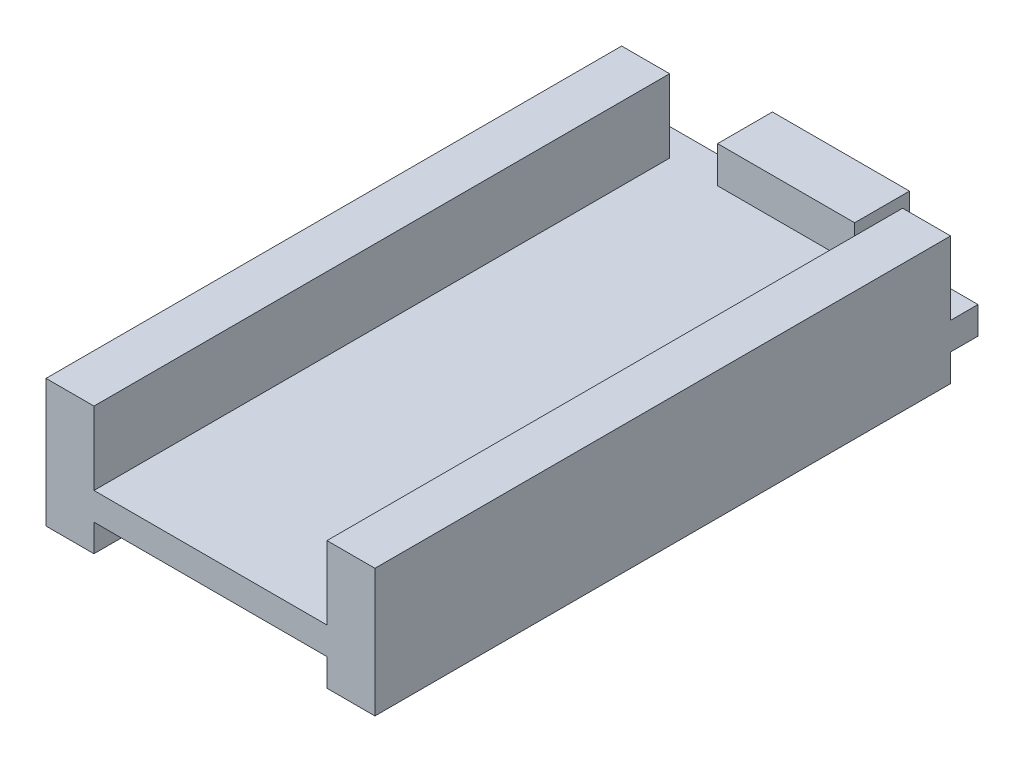
ISO-10303-21;
HEADER;
FILE_DESCRIPTION(('STEP AP214'),'2;1');
FILE_NAME('part.step','',(''),(''),'','','');
FILE_SCHEMA(('AUTOMOTIVE_DESIGN { 1 0 10303 214 1 1 1 1 }'));
ENDSEC;
DATA;
#1=APPLICATION_CONTEXT('core data for automotive mechanical design processes');
#2=APPLICATION_PROTOCOL_DEFINITION('international standard','automotive_design',2000,#1);
#3=PRODUCT_CONTEXT('',#1,'mechanical');
#4=PRODUCT('Part','Part','',(#3));
#5=PRODUCT_RELATED_PRODUCT_CATEGORY('part','',(#4));
#6=PRODUCT_DEFINITION_FORMATION('','',#4);
#7=PRODUCT_DEFINITION_CONTEXT('part definition',#1,'design');
#8=PRODUCT_DEFINITION('design','',#6,#7);
#9=PRODUCT_DEFINITION_SHAPE('','',#8);
#10=(LENGTH_UNIT() NAMED_UNIT(*) SI_UNIT(.MILLI.,.METRE.));
#11=(NAMED_UNIT(*) PLANE_ANGLE_UNIT() SI_UNIT($,.RADIAN.));
#12=(NAMED_UNIT(*) SI_UNIT($,.STERADIAN.) SOLID_ANGLE_UNIT());
#13=UNCERTAINTY_MEASURE_WITH_UNIT(LENGTH_MEASURE(1.E-05),#10,'distance_accuracy_value','');
#14=(GEOMETRIC_REPRESENTATION_CONTEXT(3) GLOBAL_UNCERTAINTY_ASSIGNED_CONTEXT((#13)) GLOBAL_UNIT_ASSIGNED_CONTEXT((#10,
#11,#12)) REPRESENTATION_CONTEXT('',''));
#15=CARTESIAN_POINT('',(0.,0.,0.));
#16=DIRECTION('',(0.,0.,1.));
#17=DIRECTION('',(1.,0.,0.));
#18=AXIS2_PLACEMENT_3D('',#15,#16,#17);
#19=CARTESIAN_POINT('',(0.,1.5,0.));
#20=DIRECTION('',(0.,1.,0.));
#21=DIRECTION('',(0.,0.,1.));
#22=AXIS2_PLACEMENT_3D('',#19,#20,#21);
#23=PLANE('',#22);
#24=DIRECTION('',(0.,0.,1.));
#25=VECTOR('',#24,1.);
#26=CARTESIAN_POINT('',(6.37499999999998,1.5,0.));
#27=LINE('',#26,#25);
#28=CARTESIAN_POINT('',(6.37500000000003,1.5,-15.));
#29=VERTEX_POINT('',#28);
#30=CARTESIAN_POINT('',(6.37499999999994,1.5,16.5));
#31=VERTEX_POINT('',#30);
#32=EDGE_CURVE('E48',#29,#31,#27,.T.);
#33=ORIENTED_EDGE('',*,*,#32,.F.);
#34=DIRECTION('',(1.,0.,0.));
#35=VECTOR('',#34,1.);
#36=CARTESIAN_POINT('',(0.,1.5,-15.));
#37=LINE('',#36,#35);
#38=CARTESIAN_POINT('',(8.99999999999996,1.5,-15.));
#39=VERTEX_POINT('',#38);
#40=EDGE_CURVE('E52',#29,#39,#37,.T.);
#41=ORIENTED_EDGE('',*,*,#40,.T.);
#42=DIRECTION('',(0.,0.,-1.));
#43=VECTOR('',#42,1.);
#44=CARTESIAN_POINT('',(8.99999999999996,1.5,0.));
#45=LINE('',#44,#43);
#46=CARTESIAN_POINT('',(8.99999999999996,1.5,-16.5));
#47=VERTEX_POINT('',#46);
#48=EDGE_CURVE('E178',#39,#47,#45,.T.);
#49=ORIENTED_EDGE('',*,*,#48,.T.);
#50=DIRECTION('',(1.,0.,0.));
#51=VECTOR('',#50,1.);
#52=CARTESIAN_POINT('',(0.,1.5,-16.5));
#53=LINE('',#52,#51);
#54=CARTESIAN_POINT('',(3.75,1.5,-16.5));
#55=VERTEX_POINT('',#54);
#56=EDGE_CURVE('E301',#55,#47,#53,.T.);
#57=ORIENTED_EDGE('',*,*,#56,.F.);
#58=DIRECTION('',(0.,0.,1.));
#59=VECTOR('',#58,1.);
#60=CARTESIAN_POINT('',(3.75,1.5,0.));
#61=LINE('',#60,#59);
#62=CARTESIAN_POINT('',(3.75,1.5,-15.));
#63=VERTEX_POINT('',#62);
#64=EDGE_CURVE('E278',#55,#63,#61,.T.);
#65=ORIENTED_EDGE('',*,*,#64,.T.);
#66=DIRECTION('',(-1.,0.,0.));
#67=VECTOR('',#66,1.);
#68=CARTESIAN_POINT('',(0.,1.5,-15.));
#69=LINE('',#68,#67);
#70=CARTESIAN_POINT('',(-3.75,1.5,-15.));
#71=VERTEX_POINT('',#70);
#72=EDGE_CURVE('E277',#63,#71,#69,.T.);
#73=ORIENTED_EDGE('',*,*,#72,.T.);
#74=DIRECTION('',(0.,0.,1.));
#75=VECTOR('',#74,1.);
#76=CARTESIAN_POINT('',(-3.75,1.5,0.));
#77=LINE('',#76,#75);
#78=CARTESIAN_POINT('',(-3.75,1.5,-16.5));
#79=VERTEX_POINT('',#78);
#80=EDGE_CURVE('E283',#79,#71,#77,.T.);
#81=ORIENTED_EDGE('',*,*,#80,.F.);
#82=CARTESIAN_POINT('',(-9.00000000000004,1.5,-16.5));
#83=VERTEX_POINT('',#82);
#84=EDGE_CURVE('E296',#83,#79,#53,.T.);
#85=ORIENTED_EDGE('',*,*,#84,.F.);
#86=DIRECTION('',(0.,0.,-1.));
#87=VECTOR('',#86,1.);
#88=CARTESIAN_POINT('',(-9.00000000000004,1.5,0.));
#89=LINE('',#88,#87);
#90=CARTESIAN_POINT('',(-9.00000000000004,1.5,-15.));
#91=VERTEX_POINT('',#90);
#92=EDGE_CURVE('E299',#91,#83,#89,.T.);
#93=ORIENTED_EDGE('',*,*,#92,.F.);
#94=DIRECTION('',(-1.,0.,0.));
#95=VECTOR('',#94,1.);
#96=CARTESIAN_POINT('',(0.,1.5,-15.));
#97=LINE('',#96,#95);
#98=CARTESIAN_POINT('',(-6.37500000000001,1.5,-15.));
#99=VERTEX_POINT('',#98);
#100=EDGE_CURVE('E259',#99,#91,#97,.T.);
#101=ORIENTED_EDGE('',*,*,#100,.F.);
#102=DIRECTION('',(0.,0.,1.));
#103=VECTOR('',#102,1.);
#104=CARTESIAN_POINT('',(-6.37500000000001,1.5,0.));
#105=LINE('',#104,#103);
#106=CARTESIAN_POINT('',(-6.37500000000001,1.5,16.5));
#107=VERTEX_POINT('',#106);
#108=EDGE_CURVE('E248',#99,#107,#105,.T.);
#109=ORIENTED_EDGE('',*,*,#108,.T.);
#110=DIRECTION('',(1.,0.,0.));
#111=VECTOR('',#110,1.);
#112=CARTESIAN_POINT('',(0.,1.5,16.5));
#113=LINE('',#112,#111);
#114=EDGE_CURVE('E303',#107,#31,#113,.T.);
#115=ORIENTED_EDGE('',*,*,#114,.T.);
#116=EDGE_LOOP('',(#33,#41,#49,#57,#65,#73,#81,#85,#93,#101,#109,#115));
#117=FACE_BOUND('',#116,.T.);
#118=ADVANCED_FACE('F33',(#117),#23,.T.);
#119=CARTESIAN_POINT('',(0.,0.,0.));
#120=DIRECTION('',(0.,1.,0.));
#121=DIRECTION('',(0.,0.,1.));
#122=AXIS2_PLACEMENT_3D('',#119,#120,#121);
#123=PLANE('',#122);
#124=DIRECTION('',(1.,0.,0.));
#125=VECTOR('',#124,1.);
#126=CARTESIAN_POINT('',(0.,0.,-15.));
#127=LINE('',#126,#125);
#128=CARTESIAN_POINT('',(6.37500000000003,0.,-15.));
#129=VERTEX_POINT('',#128);
#130=CARTESIAN_POINT('',(8.99999999999996,0.,-15.));
#131=VERTEX_POINT('',#130);
#132=EDGE_CURVE('E11',#129,#131,#127,.T.);
#133=ORIENTED_EDGE('',*,*,#132,.F.);
#134=DIRECTION('',(0.,0.,1.));
#135=VECTOR('',#134,1.);
#136=CARTESIAN_POINT('',(6.37499999999998,0.,0.));
#137=LINE('',#136,#135);
#138=CARTESIAN_POINT('',(6.37499999999998,0.,16.5));
#139=VERTEX_POINT('',#138);
#140=EDGE_CURVE('E41',#129,#139,#137,.T.);
#141=ORIENTED_EDGE('',*,*,#140,.T.);
#142=DIRECTION('',(1.,0.,0.));
#143=VECTOR('',#142,1.);
#144=CARTESIAN_POINT('',(0.,0.,16.5));
#145=LINE('',#144,#143);
#146=CARTESIAN_POINT('',(-6.37500000000001,0.,16.5));
#147=VERTEX_POINT('',#146);
#148=EDGE_CURVE('E311',#147,#139,#145,.T.);
#149=ORIENTED_EDGE('',*,*,#148,.F.);
#150=DIRECTION('',(0.,0.,1.));
#151=VECTOR('',#150,1.);
#152=CARTESIAN_POINT('',(-6.37500000000001,0.,0.));
#153=LINE('',#152,#151);
#154=CARTESIAN_POINT('',(-6.37500000000001,0.,-15.));
#155=VERTEX_POINT('',#154);
#156=EDGE_CURVE('E325',#155,#147,#153,.T.);
#157=ORIENTED_EDGE('',*,*,#156,.F.);
#158=DIRECTION('',(-1.,0.,0.));
#159=VECTOR('',#158,1.);
#160=CARTESIAN_POINT('',(0.,0.,-15.));
#161=LINE('',#160,#159);
#162=CARTESIAN_POINT('',(-9.00000000000004,0.,-15.));
#163=VERTEX_POINT('',#162);
#164=EDGE_CURVE('E328',#155,#163,#161,.T.);
#165=ORIENTED_EDGE('',*,*,#164,.T.);
#166=DIRECTION('',(0.,0.,-1.));
#167=VECTOR('',#166,1.);
#168=CARTESIAN_POINT('',(-9.00000000000004,0.,0.));
#169=LINE('',#168,#167);
#170=CARTESIAN_POINT('',(-9.00000000000004,0.,-16.5));
#171=VERTEX_POINT('',#170);
#172=EDGE_CURVE('E309',#163,#171,#169,.T.);
#173=ORIENTED_EDGE('',*,*,#172,.T.);
#174=DIRECTION('',(1.,0.,0.));
#175=VECTOR('',#174,1.);
#176=CARTESIAN_POINT('',(0.,0.,-16.5));
#177=LINE('',#176,#175);
#178=CARTESIAN_POINT('',(8.99999999999996,0.,-16.5));
#179=VERTEX_POINT('',#178);
#180=EDGE_CURVE('E287',#171,#179,#177,.T.);
#181=ORIENTED_EDGE('',*,*,#180,.T.);
#182=DIRECTION('',(0.,0.,-1.));
#183=VECTOR('',#182,1.);
#184=CARTESIAN_POINT('',(8.99999999999996,0.,0.));
#185=LINE('',#184,#183);
#186=EDGE_CURVE('E314',#131,#179,#185,.T.);
#187=ORIENTED_EDGE('',*,*,#186,.F.);
#188=EDGE_LOOP('',(#133,#141,#149,#157,#165,#173,#181,#187));
#189=FACE_BOUND('',#188,.T.);
#190=ADVANCED_FACE('F333',(#189),#123,.F.);
#191=CARTESIAN_POINT('',(0.,1.5,-16.5));
#192=DIRECTION('',(0.,0.,-1.));
#193=DIRECTION('',(-1.,0.,0.));
#194=AXIS2_PLACEMENT_3D('',#191,#192,#193);
#195=PLANE('',#194);
#196=ORIENTED_EDGE('',*,*,#180,.F.);
#197=DIRECTION('',(0.,-1.,0.));
#198=VECTOR('',#197,1.);
#199=CARTESIAN_POINT('',(-9.00000000000004,1.5,-16.5));
#200=LINE('',#199,#198);
#201=EDGE_CURVE('E322',#83,#171,#200,.T.);
#202=ORIENTED_EDGE('',*,*,#201,.F.);
#203=ORIENTED_EDGE('',*,*,#84,.T.);
#204=EDGE_CURVE('E300',#79,#55,#53,.T.);
#205=ORIENTED_EDGE('',*,*,#204,.T.);
#206=ORIENTED_EDGE('',*,*,#56,.T.);
#207=DIRECTION('',(0.,-1.,0.));
#208=VECTOR('',#207,1.);
#209=CARTESIAN_POINT('',(8.99999999999996,1.5,-16.5));
#210=LINE('',#209,#208);
#211=EDGE_CURVE('E306',#47,#179,#210,.T.);
#212=ORIENTED_EDGE('',*,*,#211,.T.);
#213=EDGE_LOOP('',(#196,#202,#203,#205,#206,#212));
#214=FACE_BOUND('',#213,.T.);
#215=ADVANCED_FACE('F35',(#214),#195,.T.);
#216=CARTESIAN_POINT('',(-9.00000000000004,1.5,0.));
#217=DIRECTION('',(-1.,0.,0.));
#218=DIRECTION('',(0.,0.,1.));
#219=AXIS2_PLACEMENT_3D('',#216,#217,#218);
#220=PLANE('',#219);
#221=ORIENTED_EDGE('',*,*,#172,.F.);
#222=DIRECTION('',(0.,1.,0.));
#223=VECTOR('',#222,1.);
#224=CARTESIAN_POINT('',(-9.00000000000004,-1.5,-15.));
#225=LINE('',#224,#223);
#226=CARTESIAN_POINT('',(-9.00000000000004,-1.5,-15.));
#227=VERTEX_POINT('',#226);
#228=EDGE_CURVE('E254',#227,#163,#225,.T.);
#229=ORIENTED_EDGE('',*,*,#228,.F.);
#230=DIRECTION('',(0.,0.,1.));
#231=VECTOR('',#230,1.);
#232=CARTESIAN_POINT('',(-9.00000000000004,-1.5,0.));
#233=LINE('',#232,#231);
#234=CARTESIAN_POINT('',(-9.00000000000004,-1.5,16.5));
#235=VERTEX_POINT('',#234);
#236=EDGE_CURVE('E236',#227,#235,#233,.T.);
#237=ORIENTED_EDGE('',*,*,#236,.T.);
#238=DIRECTION('',(0.,-1.,0.));
#239=VECTOR('',#238,1.);
#240=CARTESIAN_POINT('',(-9.00000000000004,1.5,16.5));
#241=LINE('',#240,#239);
#242=CARTESIAN_POINT('',(-9.00000000000004,5.5,16.5));
#243=VERTEX_POINT('',#242);
#244=EDGE_CURVE('E320',#243,#235,#241,.T.);
#245=ORIENTED_EDGE('',*,*,#244,.F.);
#246=DIRECTION('',(0.,0.,1.));
#247=VECTOR('',#246,1.);
#248=CARTESIAN_POINT('',(-9.00000000000004,5.5,0.));
#249=LINE('',#248,#247);
#250=CARTESIAN_POINT('',(-9.00000000000004,5.5,-15.));
#251=VERTEX_POINT('',#250);
#252=EDGE_CURVE('E224',#251,#243,#249,.T.);
#253=ORIENTED_EDGE('',*,*,#252,.F.);
#254=EDGE_CURVE('E244',#91,#251,#225,.T.);
#255=ORIENTED_EDGE('',*,*,#254,.F.);
#256=ORIENTED_EDGE('',*,*,#92,.T.);
#257=ORIENTED_EDGE('',*,*,#201,.T.);
#258=EDGE_LOOP('',(#221,#229,#237,#245,#253,#255,#256,#257));
#259=FACE_BOUND('',#258,.T.);
#260=ADVANCED_FACE('F351',(#259),#220,.T.);
#261=CARTESIAN_POINT('',(0.,1.5,16.5));
#262=DIRECTION('',(0.,0.,-1.));
#263=DIRECTION('',(-1.,0.,0.));
#264=AXIS2_PLACEMENT_3D('',#261,#262,#263);
#265=PLANE('',#264);
#266=ORIENTED_EDGE('',*,*,#148,.T.);
#267=DIRECTION('',(0.,1.,0.));
#268=VECTOR('',#267,1.);
#269=CARTESIAN_POINT('',(6.37499999999994,-1.5,16.5));
#270=LINE('',#269,#268);
#271=CARTESIAN_POINT('',(6.37499999999994,-1.5,16.5));
#272=VERTEX_POINT('',#271);
#273=EDGE_CURVE('E182',#272,#139,#270,.T.);
#274=ORIENTED_EDGE('',*,*,#273,.F.);
#275=DIRECTION('',(-1.,0.,0.));
#276=VECTOR('',#275,1.);
#277=CARTESIAN_POINT('',(0.,-1.5,16.5));
#278=LINE('',#277,#276);
#279=CARTESIAN_POINT('',(8.99999999999996,-1.5,16.5));
#280=VERTEX_POINT('',#279);
#281=EDGE_CURVE('E208',#280,#272,#278,.T.);
#282=ORIENTED_EDGE('',*,*,#281,.F.);
#283=DIRECTION('',(0.,-1.,0.));
#284=VECTOR('',#283,1.);
#285=CARTESIAN_POINT('',(8.99999999999996,1.5,16.5));
#286=LINE('',#285,#284);
#287=CARTESIAN_POINT('',(8.99999999999996,5.5,16.5));
#288=VERTEX_POINT('',#287);
#289=EDGE_CURVE('E318',#288,#280,#286,.T.);
#290=ORIENTED_EDGE('',*,*,#289,.F.);
#291=DIRECTION('',(-1.,0.,0.));
#292=VECTOR('',#291,1.);
#293=CARTESIAN_POINT('',(0.,5.5,16.5));
#294=LINE('',#293,#292);
#295=CARTESIAN_POINT('',(6.37499999999994,5.5,16.5));
#296=VERTEX_POINT('',#295);
#297=EDGE_CURVE('E191',#288,#296,#294,.T.);
#298=ORIENTED_EDGE('',*,*,#297,.T.);
#299=EDGE_CURVE('E216',#31,#296,#270,.T.);
#300=ORIENTED_EDGE('',*,*,#299,.F.);
#301=ORIENTED_EDGE('',*,*,#114,.F.);
#302=DIRECTION('',(0.,1.,0.));
#303=VECTOR('',#302,1.);
#304=CARTESIAN_POINT('',(-6.37500000000001,-1.5,16.5));
#305=LINE('',#304,#303);
#306=CARTESIAN_POINT('',(-6.37500000000001,5.5,16.5));
#307=VERTEX_POINT('',#306);
#308=EDGE_CURVE('E253',#107,#307,#305,.T.);
#309=ORIENTED_EDGE('',*,*,#308,.T.);
#310=DIRECTION('',(-1.,0.,0.));
#311=VECTOR('',#310,1.);
#312=CARTESIAN_POINT('',(0.,5.5,16.5));
#313=LINE('',#312,#311);
#314=EDGE_CURVE('E227',#307,#243,#313,.T.);
#315=ORIENTED_EDGE('',*,*,#314,.T.);
#316=ORIENTED_EDGE('',*,*,#244,.T.);
#317=DIRECTION('',(-1.,0.,0.));
#318=VECTOR('',#317,1.);
#319=CARTESIAN_POINT('',(0.,-1.5,16.5));
#320=LINE('',#319,#318);
#321=CARTESIAN_POINT('',(-6.37500000000001,-1.5,16.5));
#322=VERTEX_POINT('',#321);
#323=EDGE_CURVE('E239',#322,#235,#320,.T.);
#324=ORIENTED_EDGE('',*,*,#323,.F.);
#325=EDGE_CURVE('E250',#322,#147,#305,.T.);
#326=ORIENTED_EDGE('',*,*,#325,.T.);
#327=EDGE_LOOP('',(#266,#274,#282,#290,#298,#300,#301,#309,#315,#316,#324,#326));
#328=FACE_BOUND('',#327,.T.);
#329=ADVANCED_FACE('F338',(#328),#265,.F.);
#330=CARTESIAN_POINT('',(8.99999999999996,1.5,0.));
#331=DIRECTION('',(-1.,0.,0.));
#332=DIRECTION('',(0.,0.,1.));
#333=AXIS2_PLACEMENT_3D('',#330,#331,#332);
#334=PLANE('',#333);
#335=ORIENTED_EDGE('',*,*,#289,.T.);
#336=DIRECTION('',(0.,0.,1.));
#337=VECTOR('',#336,1.);
#338=CARTESIAN_POINT('',(8.99999999999996,-1.5,0.));
#339=LINE('',#338,#337);
#340=CARTESIAN_POINT('',(8.99999999999996,-1.5,-15.));
#341=VERTEX_POINT('',#340);
#342=EDGE_CURVE('E205',#341,#280,#339,.T.);
#343=ORIENTED_EDGE('',*,*,#342,.F.);
#344=DIRECTION('',(0.,1.,0.));
#345=VECTOR('',#344,1.);
#346=CARTESIAN_POINT('',(8.99999999999996,-1.5,-15.));
#347=LINE('',#346,#345);
#348=EDGE_CURVE('E181',#341,#131,#347,.T.);
#349=ORIENTED_EDGE('',*,*,#348,.T.);
#350=ORIENTED_EDGE('',*,*,#186,.T.);
#351=ORIENTED_EDGE('',*,*,#211,.F.);
#352=ORIENTED_EDGE('',*,*,#48,.F.);
#353=CARTESIAN_POINT('',(8.99999999999996,5.5,-15.));
#354=VERTEX_POINT('',#353);
#355=EDGE_CURVE('E173',#39,#354,#347,.T.);
#356=ORIENTED_EDGE('',*,*,#355,.T.);
#357=DIRECTION('',(0.,0.,1.));
#358=VECTOR('',#357,1.);
#359=CARTESIAN_POINT('',(8.99999999999996,5.5,0.));
#360=LINE('',#359,#358);
#361=EDGE_CURVE('E176',#354,#288,#360,.T.);
#362=ORIENTED_EDGE('',*,*,#361,.T.);
#363=EDGE_LOOP('',(#335,#343,#349,#350,#351,#352,#356,#362));
#364=FACE_BOUND('',#363,.T.);
#365=ADVANCED_FACE('F175',(#364),#334,.F.);
#366=CARTESIAN_POINT('',(0.,1.5,0.));
#367=DIRECTION('',(0.,-1.,0.));
#368=DIRECTION('',(0.,0.,-1.));
#369=AXIS2_PLACEMENT_3D('',#366,#367,#368);
#370=PLANE('',#369);
#371=ORIENTED_EDGE('',*,*,#204,.F.);
#372=CARTESIAN_POINT('',(-3.75,1.5,-18.));
#373=VERTEX_POINT('',#372);
#374=EDGE_CURVE('E280',#373,#79,#77,.T.);
#375=ORIENTED_EDGE('',*,*,#374,.F.);
#376=DIRECTION('',(-1.,0.,0.));
#377=VECTOR('',#376,1.);
#378=CARTESIAN_POINT('',(0.,1.5,-18.));
#379=LINE('',#378,#377);
#380=CARTESIAN_POINT('',(3.75,1.5,-18.));
#381=VERTEX_POINT('',#380);
#382=EDGE_CURVE('E267',#381,#373,#379,.T.);
#383=ORIENTED_EDGE('',*,*,#382,.F.);
#384=EDGE_CURVE('E262',#381,#55,#61,.T.);
#385=ORIENTED_EDGE('',*,*,#384,.T.);
#386=EDGE_LOOP('',(#371,#375,#383,#385));
#387=FACE_BOUND('',#386,.T.);
#388=ADVANCED_FACE('F379',(#387),#370,.T.);
#389=CARTESIAN_POINT('',(3.75,3.5,0.));
#390=DIRECTION('',(1.,0.,0.));
#391=DIRECTION('',(0.,0.,-1.));
#392=AXIS2_PLACEMENT_3D('',#389,#390,#391);
#393=PLANE('',#392);
#394=ORIENTED_EDGE('',*,*,#384,.F.);
#395=DIRECTION('',(0.,-1.,0.));
#396=VECTOR('',#395,1.);
#397=CARTESIAN_POINT('',(3.75,3.5,-18.));
#398=LINE('',#397,#396);
#399=CARTESIAN_POINT('',(3.75,3.5,-18.));
#400=VERTEX_POINT('',#399);
#401=EDGE_CURVE('E285',#400,#381,#398,.T.);
#402=ORIENTED_EDGE('',*,*,#401,.F.);
#403=DIRECTION('',(0.,0.,1.));
#404=VECTOR('',#403,1.);
#405=CARTESIAN_POINT('',(3.75,3.5,0.));
#406=LINE('',#405,#404);
#407=CARTESIAN_POINT('',(3.75,3.5,-15.));
#408=VERTEX_POINT('',#407);
#409=EDGE_CURVE('E263',#400,#408,#406,.T.);
#410=ORIENTED_EDGE('',*,*,#409,.T.);
#411=DIRECTION('',(0.,-1.,0.));
#412=VECTOR('',#411,1.);
#413=CARTESIAN_POINT('',(3.75,3.5,-15.));
#414=LINE('',#413,#412);
#415=EDGE_CURVE('E274',#408,#63,#414,.T.);
#416=ORIENTED_EDGE('',*,*,#415,.T.);
#417=ORIENTED_EDGE('',*,*,#64,.F.);
#418=EDGE_LOOP('',(#394,#402,#410,#416,#417));
#419=FACE_BOUND('',#418,.T.);
#420=ADVANCED_FACE('F374',(#419),#393,.T.);
#421=CARTESIAN_POINT('',(0.,3.5,-18.));
#422=DIRECTION('',(0.,0.,1.));
#423=DIRECTION('',(1.,0.,0.));
#424=AXIS2_PLACEMENT_3D('',#421,#422,#423);
#425=PLANE('',#424);
#426=ORIENTED_EDGE('',*,*,#382,.T.);
#427=DIRECTION('',(0.,-1.,0.));
#428=VECTOR('',#427,1.);
#429=CARTESIAN_POINT('',(-3.75,3.5,-18.));
#430=LINE('',#429,#428);
#431=CARTESIAN_POINT('',(-3.75,3.5,-18.));
#432=VERTEX_POINT('',#431);
#433=EDGE_CURVE('E288',#432,#373,#430,.T.);
#434=ORIENTED_EDGE('',*,*,#433,.F.);
#435=DIRECTION('',(-1.,0.,0.));
#436=VECTOR('',#435,1.);
#437=CARTESIAN_POINT('',(0.,3.5,-18.));
#438=LINE('',#437,#436);
#439=EDGE_CURVE('E272',#400,#432,#438,.T.);
#440=ORIENTED_EDGE('',*,*,#439,.F.);
#441=ORIENTED_EDGE('',*,*,#401,.T.);
#442=EDGE_LOOP('',(#426,#434,#440,#441));
#443=FACE_BOUND('',#442,.T.);
#444=ADVANCED_FACE('F410',(#443),#425,.F.);
#445=CARTESIAN_POINT('',(-3.75,3.5,0.));
#446=DIRECTION('',(1.,0.,0.));
#447=DIRECTION('',(0.,0.,-1.));
#448=AXIS2_PLACEMENT_3D('',#445,#446,#447);
#449=PLANE('',#448);
#450=ORIENTED_EDGE('',*,*,#374,.T.);
#451=ORIENTED_EDGE('',*,*,#80,.T.);
#452=DIRECTION('',(0.,-1.,0.));
#453=VECTOR('',#452,1.);
#454=CARTESIAN_POINT('',(-3.75,3.5,-15.));
#455=LINE('',#454,#453);
#456=CARTESIAN_POINT('',(-3.75,3.5,-15.));
#457=VERTEX_POINT('',#456);
#458=EDGE_CURVE('E291',#457,#71,#455,.T.);
#459=ORIENTED_EDGE('',*,*,#458,.F.);
#460=DIRECTION('',(0.,0.,1.));
#461=VECTOR('',#460,1.);
#462=CARTESIAN_POINT('',(-3.75,3.5,0.));
#463=LINE('',#462,#461);
#464=EDGE_CURVE('E270',#432,#457,#463,.T.);
#465=ORIENTED_EDGE('',*,*,#464,.F.);
#466=ORIENTED_EDGE('',*,*,#433,.T.);
#467=EDGE_LOOP('',(#450,#451,#459,#465,#466));
#468=FACE_BOUND('',#467,.T.);
#469=ADVANCED_FACE('F404',(#468),#449,.F.);
#470=CARTESIAN_POINT('',(0.,3.5,-15.));
#471=DIRECTION('',(0.,0.,1.));
#472=DIRECTION('',(1.,0.,0.));
#473=AXIS2_PLACEMENT_3D('',#470,#471,#472);
#474=PLANE('',#473);
#475=ORIENTED_EDGE('',*,*,#72,.F.);
#476=ORIENTED_EDGE('',*,*,#415,.F.);
#477=DIRECTION('',(-1.,0.,0.));
#478=VECTOR('',#477,1.);
#479=CARTESIAN_POINT('',(0.,3.5,-15.));
#480=LINE('',#479,#478);
#481=EDGE_CURVE('E266',#408,#457,#480,.T.);
#482=ORIENTED_EDGE('',*,*,#481,.T.);
#483=ORIENTED_EDGE('',*,*,#458,.T.);
#484=EDGE_LOOP('',(#475,#476,#482,#483));
#485=FACE_BOUND('',#484,.T.);
#486=ADVANCED_FACE('F363',(#485),#474,.T.);
#487=CARTESIAN_POINT('',(0.,3.5,0.));
#488=DIRECTION('',(0.,-1.,0.));
#489=DIRECTION('',(0.,0.,-1.));
#490=AXIS2_PLACEMENT_3D('',#487,#488,#489);
#491=PLANE('',#490);
#492=ORIENTED_EDGE('',*,*,#409,.F.);
#493=ORIENTED_EDGE('',*,*,#439,.T.);
#494=ORIENTED_EDGE('',*,*,#464,.T.);
#495=ORIENTED_EDGE('',*,*,#481,.F.);
#496=EDGE_LOOP('',(#492,#493,#494,#495));
#497=FACE_BOUND('',#496,.T.);
#498=ADVANCED_FACE('F355',(#497),#491,.F.);
#499=CARTESIAN_POINT('',(0.,-1.5,0.));
#500=DIRECTION('',(0.,1.,0.));
#501=DIRECTION('',(0.,0.,1.));
#502=AXIS2_PLACEMENT_3D('',#499,#500,#501);
#503=PLANE('',#502);
#504=DIRECTION('',(-1.,0.,0.));
#505=VECTOR('',#504,1.);
#506=CARTESIAN_POINT('',(0.,-1.5,-15.));
#507=LINE('',#506,#505);
#508=CARTESIAN_POINT('',(-6.37500000000001,-1.5,-15.));
#509=VERTEX_POINT('',#508);
#510=EDGE_CURVE('E233',#509,#227,#507,.T.);
#511=ORIENTED_EDGE('',*,*,#510,.F.);
#512=DIRECTION('',(0.,0.,1.));
#513=VECTOR('',#512,1.);
#514=CARTESIAN_POINT('',(-6.37500000000001,-1.5,0.));
#515=LINE('',#514,#513);
#516=EDGE_CURVE('E242',#509,#322,#515,.T.);
#517=ORIENTED_EDGE('',*,*,#516,.T.);
#518=ORIENTED_EDGE('',*,*,#323,.T.);
#519=ORIENTED_EDGE('',*,*,#236,.F.);
#520=EDGE_LOOP('',(#511,#517,#518,#519));
#521=FACE_BOUND('',#520,.T.);
#522=ADVANCED_FACE('F353',(#521),#503,.F.);
#523=CARTESIAN_POINT('',(-6.37500000000001,-1.5,0.));
#524=DIRECTION('',(-1.,0.,0.));
#525=DIRECTION('',(0.,0.,1.));
#526=AXIS2_PLACEMENT_3D('',#523,#524,#525);
#527=PLANE('',#526);
#528=DIRECTION('',(0.,1.,0.));
#529=VECTOR('',#528,1.);
#530=CARTESIAN_POINT('',(-6.37500000000001,-1.5,-15.));
#531=LINE('',#530,#529);
#532=EDGE_CURVE('E245',#509,#155,#531,.T.);
#533=ORIENTED_EDGE('',*,*,#532,.T.);
#534=ORIENTED_EDGE('',*,*,#156,.T.);
#535=ORIENTED_EDGE('',*,*,#325,.F.);
#536=ORIENTED_EDGE('',*,*,#516,.F.);
#537=EDGE_LOOP('',(#533,#534,#535,#536));
#538=FACE_BOUND('',#537,.T.);
#539=ADVANCED_FACE('F344',(#538),#527,.F.);
#540=CARTESIAN_POINT('',(0.,-1.5,-15.));
#541=DIRECTION('',(0.,0.,-1.));
#542=DIRECTION('',(-1.,0.,0.));
#543=AXIS2_PLACEMENT_3D('',#540,#541,#542);
#544=PLANE('',#543);
#545=ORIENTED_EDGE('',*,*,#164,.F.);
#546=ORIENTED_EDGE('',*,*,#532,.F.);
#547=ORIENTED_EDGE('',*,*,#510,.T.);
#548=ORIENTED_EDGE('',*,*,#228,.T.);
#549=EDGE_LOOP('',(#545,#546,#547,#548));
#550=FACE_BOUND('',#549,.T.);
#551=ADVANCED_FACE('F348',(#550),#544,.T.);
#552=CARTESIAN_POINT('',(-6.37500000000001,5.5,-15.));
#553=VERTEX_POINT('',#552);
#554=EDGE_CURVE('E249',#99,#553,#531,.T.);
#555=ORIENTED_EDGE('',*,*,#554,.F.);
#556=ORIENTED_EDGE('',*,*,#100,.T.);
#557=ORIENTED_EDGE('',*,*,#254,.T.);
#558=DIRECTION('',(-1.,0.,0.));
#559=VECTOR('',#558,1.);
#560=CARTESIAN_POINT('',(0.,5.5,-15.));
#561=LINE('',#560,#559);
#562=EDGE_CURVE('E221',#553,#251,#561,.T.);
#563=ORIENTED_EDGE('',*,*,#562,.F.);
#564=EDGE_LOOP('',(#555,#556,#557,#563));
#565=FACE_BOUND('',#564,.T.);
#566=ADVANCED_FACE('F448',(#565),#544,.T.);
#567=ORIENTED_EDGE('',*,*,#108,.F.);
#568=ORIENTED_EDGE('',*,*,#554,.T.);
#569=DIRECTION('',(0.,0.,1.));
#570=VECTOR('',#569,1.);
#571=CARTESIAN_POINT('',(-6.37500000000001,5.5,0.));
#572=LINE('',#571,#570);
#573=EDGE_CURVE('E230',#553,#307,#572,.T.);
#574=ORIENTED_EDGE('',*,*,#573,.T.);
#575=ORIENTED_EDGE('',*,*,#308,.F.);
#576=EDGE_LOOP('',(#567,#568,#574,#575));
#577=FACE_BOUND('',#576,.T.);
#578=ADVANCED_FACE('F362',(#577),#527,.F.);
#579=CARTESIAN_POINT('',(0.,5.5,0.));
#580=DIRECTION('',(0.,1.,0.));
#581=DIRECTION('',(0.,0.,1.));
#582=AXIS2_PLACEMENT_3D('',#579,#580,#581);
#583=PLANE('',#582);
#584=ORIENTED_EDGE('',*,*,#562,.T.);
#585=ORIENTED_EDGE('',*,*,#252,.T.);
#586=ORIENTED_EDGE('',*,*,#314,.F.);
#587=ORIENTED_EDGE('',*,*,#573,.F.);
#588=EDGE_LOOP('',(#584,#585,#586,#587));
#589=FACE_BOUND('',#588,.T.);
#590=ADVANCED_FACE('F440',(#589),#583,.T.);
#591=CARTESIAN_POINT('',(0.,-1.5,0.));
#592=DIRECTION('',(0.,-1.,0.));
#593=DIRECTION('',(0.,0.,-1.));
#594=AXIS2_PLACEMENT_3D('',#591,#592,#593);
#595=PLANE('',#594);
#596=DIRECTION('',(1.,0.,0.));
#597=VECTOR('',#596,1.);
#598=CARTESIAN_POINT('',(0.,-1.5,-15.));
#599=LINE('',#598,#597);
#600=CARTESIAN_POINT('',(6.37500000000003,-1.5,-15.));
#601=VERTEX_POINT('',#600);
#602=EDGE_CURVE('E202',#601,#341,#599,.T.);
#603=ORIENTED_EDGE('',*,*,#602,.T.);
#604=ORIENTED_EDGE('',*,*,#342,.T.);
#605=ORIENTED_EDGE('',*,*,#281,.T.);
#606=DIRECTION('',(0.,0.,1.));
#607=VECTOR('',#606,1.);
#608=CARTESIAN_POINT('',(6.37499999999998,-1.5,0.));
#609=LINE('',#608,#607);
#610=EDGE_CURVE('E210',#601,#272,#609,.T.);
#611=ORIENTED_EDGE('',*,*,#610,.F.);
#612=EDGE_LOOP('',(#603,#604,#605,#611));
#613=FACE_BOUND('',#612,.T.);
#614=ADVANCED_FACE('F421',(#613),#595,.T.);
#615=CARTESIAN_POINT('',(6.37499999999998,-1.5,0.));
#616=DIRECTION('',(-1.,0.,0.));
#617=DIRECTION('',(0.,0.,1.));
#618=AXIS2_PLACEMENT_3D('',#615,#616,#617);
#619=PLANE('',#618);
#620=ORIENTED_EDGE('',*,*,#140,.F.);
#621=DIRECTION('',(0.,1.,0.));
#622=VECTOR('',#621,1.);
#623=CARTESIAN_POINT('',(6.37500000000003,-1.5,-15.));
#624=LINE('',#623,#622);
#625=EDGE_CURVE('E213',#601,#129,#624,.T.);
#626=ORIENTED_EDGE('',*,*,#625,.F.);
#627=ORIENTED_EDGE('',*,*,#610,.T.);
#628=ORIENTED_EDGE('',*,*,#273,.T.);
#629=EDGE_LOOP('',(#620,#626,#627,#628));
#630=FACE_BOUND('',#629,.T.);
#631=ADVANCED_FACE('F419',(#630),#619,.T.);
#632=CARTESIAN_POINT('',(0.,-1.5,-15.));
#633=DIRECTION('',(0.,0.,1.));
#634=DIRECTION('',(1.,0.,0.));
#635=AXIS2_PLACEMENT_3D('',#632,#633,#634);
#636=PLANE('',#635);
#637=ORIENTED_EDGE('',*,*,#625,.T.);
#638=ORIENTED_EDGE('',*,*,#132,.T.);
#639=ORIENTED_EDGE('',*,*,#348,.F.);
#640=ORIENTED_EDGE('',*,*,#602,.F.);
#641=EDGE_LOOP('',(#637,#638,#639,#640));
#642=FACE_BOUND('',#641,.T.);
#643=ADVANCED_FACE('F417',(#642),#636,.F.);
#644=ORIENTED_EDGE('',*,*,#40,.F.);
#645=CARTESIAN_POINT('',(6.37500000000003,5.5,-15.));
#646=VERTEX_POINT('',#645);
#647=EDGE_CURVE('E195',#29,#646,#624,.T.);
#648=ORIENTED_EDGE('',*,*,#647,.T.);
#649=DIRECTION('',(1.,0.,0.));
#650=VECTOR('',#649,1.);
#651=CARTESIAN_POINT('',(0.,5.5,-15.));
#652=LINE('',#651,#650);
#653=EDGE_CURVE('E189',#646,#354,#652,.T.);
#654=ORIENTED_EDGE('',*,*,#653,.T.);
#655=ORIENTED_EDGE('',*,*,#355,.F.);
#656=EDGE_LOOP('',(#644,#648,#654,#655));
#657=FACE_BOUND('',#656,.T.);
#658=ADVANCED_FACE('F193',(#657),#636,.F.);
#659=ORIENTED_EDGE('',*,*,#647,.F.);
#660=ORIENTED_EDGE('',*,*,#32,.T.);
#661=ORIENTED_EDGE('',*,*,#299,.T.);
#662=DIRECTION('',(0.,0.,1.));
#663=VECTOR('',#662,1.);
#664=CARTESIAN_POINT('',(6.37499999999998,5.5,0.));
#665=LINE('',#664,#663);
#666=EDGE_CURVE('E200',#646,#296,#665,.T.);
#667=ORIENTED_EDGE('',*,*,#666,.F.);
#668=EDGE_LOOP('',(#659,#660,#661,#667));
#669=FACE_BOUND('',#668,.T.);
#670=ADVANCED_FACE('F425',(#669),#619,.T.);
#671=CARTESIAN_POINT('',(0.,5.5,0.));
#672=DIRECTION('',(0.,-1.,0.));
#673=DIRECTION('',(0.,0.,-1.));
#674=AXIS2_PLACEMENT_3D('',#671,#672,#673);
#675=PLANE('',#674);
#676=ORIENTED_EDGE('',*,*,#653,.F.);
#677=ORIENTED_EDGE('',*,*,#666,.T.);
#678=ORIENTED_EDGE('',*,*,#297,.F.);
#679=ORIENTED_EDGE('',*,*,#361,.F.);
#680=EDGE_LOOP('',(#676,#677,#678,#679));
#681=FACE_BOUND('',#680,.T.);
#682=ADVANCED_FACE('F187',(#681),#675,.F.);
#683=CLOSED_SHELL('',(#118,#190,#215,#260,#329,#365,#388,#420,#444,#469,#486,#498,#522,#539,
#551,#566,#578,#590,#614,#631,#643,#658,#670,#682));
#684=MANIFOLD_SOLID_BREP('B2',#683);
#685=ADVANCED_BREP_SHAPE_REPRESENTATION('',(#18,#684),#14);
#686=SHAPE_DEFINITION_REPRESENTATION(#9,#685);
ENDSEC;
END-ISO-10303-21;
